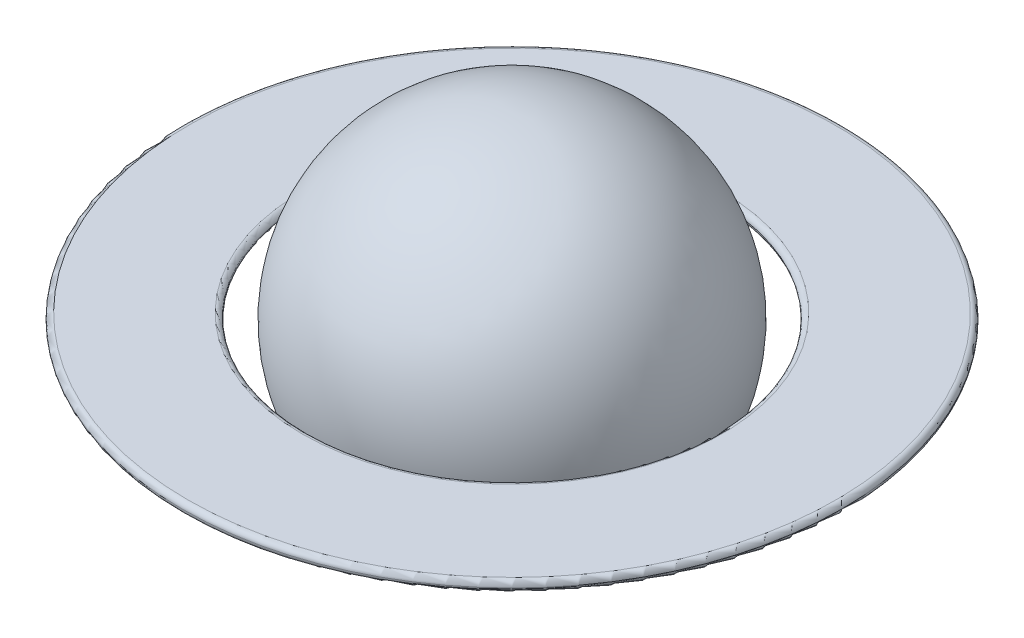
ISO-10303-21;
HEADER;
FILE_DESCRIPTION(('STEP AP214'),'2;1');
FILE_NAME('part.step','',(''),(''),'','','');
FILE_SCHEMA(('AUTOMOTIVE_DESIGN { 1 0 10303 214 1 1 1 1 }'));
ENDSEC;
DATA;
#1=APPLICATION_CONTEXT('core data for automotive mechanical design processes');
#2=APPLICATION_PROTOCOL_DEFINITION('international standard','automotive_design',2000,#1);
#3=PRODUCT_CONTEXT('',#1,'mechanical');
#4=PRODUCT('Part','Part','',(#3));
#5=PRODUCT_RELATED_PRODUCT_CATEGORY('part','',(#4));
#6=PRODUCT_DEFINITION_FORMATION('','',#4);
#7=PRODUCT_DEFINITION_CONTEXT('part definition',#1,'design');
#8=PRODUCT_DEFINITION('design','',#6,#7);
#9=PRODUCT_DEFINITION_SHAPE('','',#8);
#10=(LENGTH_UNIT() NAMED_UNIT(*) SI_UNIT(.MILLI.,.METRE.));
#11=(NAMED_UNIT(*) PLANE_ANGLE_UNIT() SI_UNIT($,.RADIAN.));
#12=(NAMED_UNIT(*) SI_UNIT($,.STERADIAN.) SOLID_ANGLE_UNIT());
#13=UNCERTAINTY_MEASURE_WITH_UNIT(LENGTH_MEASURE(1.E-05),#10,'distance_accuracy_value','');
#14=(GEOMETRIC_REPRESENTATION_CONTEXT(3) GLOBAL_UNCERTAINTY_ASSIGNED_CONTEXT((#13)) GLOBAL_UNIT_ASSIGNED_CONTEXT((#10,
#11,#12)) REPRESENTATION_CONTEXT('',''));
#15=CARTESIAN_POINT('',(0.,0.,0.));
#16=DIRECTION('',(0.,0.,1.));
#17=DIRECTION('',(1.,0.,0.));
#18=AXIS2_PLACEMENT_3D('',#15,#16,#17);
#19=CARTESIAN_POINT('',(0.,485.,0.));
#20=DIRECTION('',(0.,1.,0.));
#21=DIRECTION('',(0.,0.,1.));
#22=AXIS2_PLACEMENT_3D('',#19,#20,#21);
#23=PLANE('',#22);
#24=CARTESIAN_POINT('',(0.,485.,0.));
#25=DIRECTION('',(0.,1.,0.));
#26=DIRECTION('',(0.,0.,1.));
#27=AXIS2_PLACEMENT_3D('',#24,#25,#26);
#28=CIRCLE('',#27,584.021341934202);
#29=CARTESIAN_POINT('',(0.,485.,584.021341934202));
#30=VERTEX_POINT('',#29);
#31=EDGE_CURVE('E11',#30,#30,#28,.T.);
#32=ORIENTED_EDGE('',*,*,#31,.T.);
#33=EDGE_LOOP('',(#32));
#34=FACE_BOUND('',#33,.T.);
#35=CARTESIAN_POINT('',(0.,485.,0.));
#36=DIRECTION('',(0.,1.,0.));
#37=DIRECTION('',(0.,0.,1.));
#38=AXIS2_PLACEMENT_3D('',#35,#36,#37);
#39=CIRCLE('',#38,901.85736604162);
#40=CARTESIAN_POINT('',(0.,485.,901.85736604162));
#41=VERTEX_POINT('',#40);
#42=EDGE_CURVE('E45',#41,#41,#39,.F.);
#43=ORIENTED_EDGE('',*,*,#42,.T.);
#44=EDGE_LOOP('',(#43));
#45=FACE_BOUND('',#44,.T.);
#46=ADVANCED_FACE('F37',(#34,#45),#23,.F.);
#47=CARTESIAN_POINT('',(0.,515.,0.));
#48=DIRECTION('',(0.,1.,0.));
#49=DIRECTION('',(0.,0.,1.));
#50=AXIS2_PLACEMENT_3D('',#47,#48,#49);
#51=PLANE('',#50);
#52=CARTESIAN_POINT('',(0.,515.,0.));
#53=DIRECTION('',(0.,1.,0.));
#54=DIRECTION('',(0.,0.,1.));
#55=AXIS2_PLACEMENT_3D('',#52,#53,#54);
#56=CIRCLE('',#55,584.021341934202);
#57=CARTESIAN_POINT('',(0.,515.,584.021341934202));
#58=VERTEX_POINT('',#57);
#59=EDGE_CURVE('E50',#58,#58,#56,.F.);
#60=ORIENTED_EDGE('',*,*,#59,.T.);
#61=EDGE_LOOP('',(#60));
#62=FACE_BOUND('',#61,.T.);
#63=CARTESIAN_POINT('',(0.,515.,0.));
#64=DIRECTION('',(0.,1.,0.));
#65=DIRECTION('',(0.,0.,1.));
#66=AXIS2_PLACEMENT_3D('',#63,#64,#65);
#67=CIRCLE('',#66,901.85736604162);
#68=CARTESIAN_POINT('',(0.,515.,901.85736604162));
#69=VERTEX_POINT('',#68);
#70=EDGE_CURVE('E55',#69,#69,#67,.T.);
#71=ORIENTED_EDGE('',*,*,#70,.T.);
#72=EDGE_LOOP('',(#71));
#73=FACE_BOUND('',#72,.T.);
#74=ADVANCED_FACE('F78',(#62,#73),#51,.T.);
#75=CARTESIAN_POINT('',(0.,500.,0.));
#76=DIRECTION('',(0.,1.,0.));
#77=DIRECTION('',(0.,0.,1.));
#78=AXIS2_PLACEMENT_3D('',#75,#76,#77);
#79=TOROIDAL_SURFACE('',#78,584.021341934202,15.);
#80=ORIENTED_EDGE('',*,*,#31,.F.);
#81=EDGE_LOOP('',(#80));
#82=FACE_BOUND('',#81,.T.);
#83=CARTESIAN_POINT('',(0.,500.,0.));
#84=DIRECTION('',(0.,1.,0.));
#85=DIRECTION('',(0.,0.,1.));
#86=AXIS2_PLACEMENT_3D('',#83,#84,#85);
#87=CIRCLE('',#86,569.021341934202);
#88=CARTESIAN_POINT('',(0.,500.,569.021341934202));
#89=VERTEX_POINT('',#88);
#90=EDGE_CURVE('E53',#89,#89,#87,.F.);
#91=ORIENTED_EDGE('',*,*,#90,.F.);
#92=EDGE_LOOP('',(#91));
#93=FACE_BOUND('',#92,.T.);
#94=ADVANCED_FACE('F73',(#82,#93),#79,.T.);
#95=CARTESIAN_POINT('',(0.,500.,0.));
#96=DIRECTION('',(0.,1.,0.));
#97=DIRECTION('',(0.,0.,1.));
#98=AXIS2_PLACEMENT_3D('',#95,#96,#97);
#99=TOROIDAL_SURFACE('',#98,584.021341934202,15.);
#100=ORIENTED_EDGE('',*,*,#59,.F.);
#101=EDGE_LOOP('',(#100));
#102=FACE_BOUND('',#101,.T.);
#103=ORIENTED_EDGE('',*,*,#90,.T.);
#104=EDGE_LOOP('',(#103));
#105=FACE_BOUND('',#104,.T.);
#106=ADVANCED_FACE('F67',(#102,#105),#99,.T.);
#107=CARTESIAN_POINT('',(0.,500.,0.));
#108=DIRECTION('',(0.,1.,0.));
#109=DIRECTION('',(0.,0.,1.));
#110=AXIS2_PLACEMENT_3D('',#107,#108,#109);
#111=TOROIDAL_SURFACE('',#110,901.85736604162,15.);
#112=ORIENTED_EDGE('',*,*,#42,.F.);
#113=EDGE_LOOP('',(#112));
#114=FACE_BOUND('',#113,.T.);
#115=CARTESIAN_POINT('',(0.,500.,0.));
#116=DIRECTION('',(0.,1.,0.));
#117=DIRECTION('',(0.,0.,1.));
#118=AXIS2_PLACEMENT_3D('',#115,#116,#117);
#119=CIRCLE('',#118,916.85736604162);
#120=CARTESIAN_POINT('',(0.,500.,916.85736604162));
#121=VERTEX_POINT('',#120);
#122=EDGE_CURVE('E41',#121,#121,#119,.T.);
#123=ORIENTED_EDGE('',*,*,#122,.F.);
#124=EDGE_LOOP('',(#123));
#125=FACE_BOUND('',#124,.T.);
#126=ADVANCED_FACE('F39',(#114,#125),#111,.T.);
#127=CARTESIAN_POINT('',(0.,500.,0.));
#128=DIRECTION('',(0.,1.,0.));
#129=DIRECTION('',(0.,0.,1.));
#130=AXIS2_PLACEMENT_3D('',#127,#128,#129);
#131=TOROIDAL_SURFACE('',#130,901.85736604162,15.);
#132=ORIENTED_EDGE('',*,*,#122,.T.);
#133=EDGE_LOOP('',(#132));
#134=FACE_BOUND('',#133,.T.);
#135=ORIENTED_EDGE('',*,*,#70,.F.);
#136=EDGE_LOOP('',(#135));
#137=FACE_BOUND('',#136,.T.);
#138=ADVANCED_FACE('F63',(#134,#137),#131,.T.);
#139=CLOSED_SHELL('',(#46,#74,#94,#106,#126,#138));
#140=MANIFOLD_SOLID_BREP('B2',#139);
#141=CARTESIAN_POINT('',(0.,500.,0.));
#142=DIRECTION('',(0.,-1.,0.));
#143=DIRECTION('',(-1.,0.,0.));
#144=AXIS2_PLACEMENT_3D('',#141,#142,#143);
#145=SPHERICAL_SURFACE('',#144,500.);
#146=CARTESIAN_POINT('',(0.,0.,0.));
#147=VERTEX_POINT('',#146);
#148=VERTEX_LOOP('',#147);
#149=FACE_BOUND('',#148,.T.);
#150=ADVANCED_FACE('F128',(#149),#145,.T.);
#151=CLOSED_SHELL('',(#150));
#152=MANIFOLD_SOLID_BREP('B6',#151);
#153=ADVANCED_BREP_SHAPE_REPRESENTATION('',(#18,#140,#152),#14);
#154=SHAPE_DEFINITION_REPRESENTATION(#9,#153);
ENDSEC;
END-ISO-10303-21;
